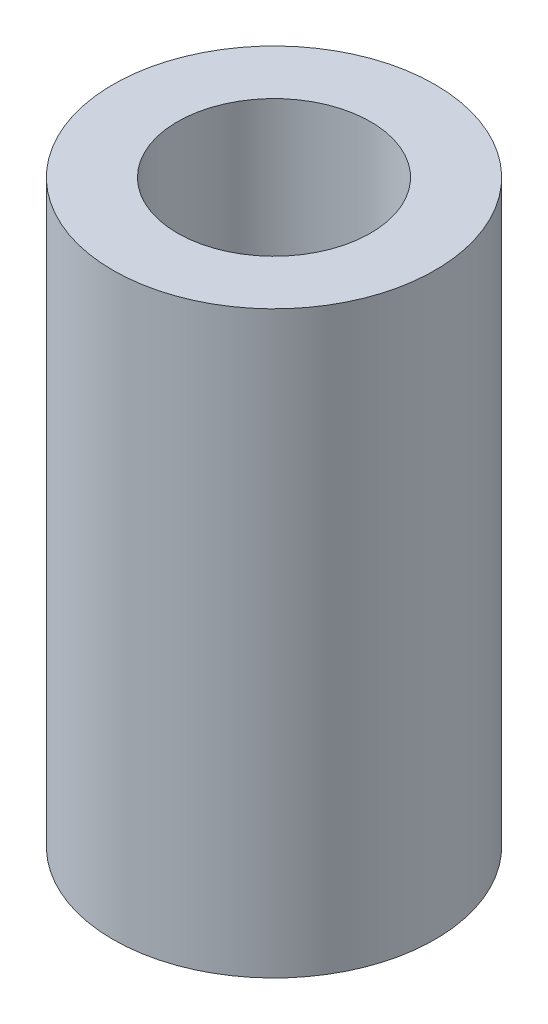
ISO-10303-21;
HEADER;
FILE_DESCRIPTION(('STEP AP214'),'2;1');
FILE_NAME('part.step','',(''),(''),'','','');
FILE_SCHEMA(('AUTOMOTIVE_DESIGN { 1 0 10303 214 1 1 1 1 }'));
ENDSEC;
DATA;
#1=APPLICATION_CONTEXT('core data for automotive mechanical design processes');
#2=APPLICATION_PROTOCOL_DEFINITION('international standard','automotive_design',2000,#1);
#3=PRODUCT_CONTEXT('',#1,'mechanical');
#4=PRODUCT('Part','Part','',(#3));
#5=PRODUCT_RELATED_PRODUCT_CATEGORY('part','',(#4));
#6=PRODUCT_DEFINITION_FORMATION('','',#4);
#7=PRODUCT_DEFINITION_CONTEXT('part definition',#1,'design');
#8=PRODUCT_DEFINITION('design','',#6,#7);
#9=PRODUCT_DEFINITION_SHAPE('','',#8);
#10=(LENGTH_UNIT() NAMED_UNIT(*) SI_UNIT(.MILLI.,.METRE.));
#11=(NAMED_UNIT(*) PLANE_ANGLE_UNIT() SI_UNIT($,.RADIAN.));
#12=(NAMED_UNIT(*) SI_UNIT($,.STERADIAN.) SOLID_ANGLE_UNIT());
#13=UNCERTAINTY_MEASURE_WITH_UNIT(LENGTH_MEASURE(1.E-05),#10,'distance_accuracy_value','');
#14=(GEOMETRIC_REPRESENTATION_CONTEXT(3) GLOBAL_UNCERTAINTY_ASSIGNED_CONTEXT((#13)) GLOBAL_UNIT_ASSIGNED_CONTEXT((#10,
#11,#12)) REPRESENTATION_CONTEXT('',''));
#15=CARTESIAN_POINT('',(0.,0.,0.));
#16=DIRECTION('',(0.,0.,1.));
#17=DIRECTION('',(1.,0.,0.));
#18=AXIS2_PLACEMENT_3D('',#15,#16,#17);
#19=CARTESIAN_POINT('',(0.,3.,0.));
#20=DIRECTION('',(0.,-1.,0.));
#21=DIRECTION('',(0.,0.,-1.));
#22=AXIS2_PLACEMENT_3D('',#19,#20,#21);
#23=CYLINDRICAL_SURFACE('',#22,5.);
#24=CARTESIAN_POINT('',(0.,0.,0.));
#25=DIRECTION('',(0.,1.,0.));
#26=DIRECTION('',(0.,0.,1.));
#27=AXIS2_PLACEMENT_3D('',#24,#25,#26);
#28=CIRCLE('',#27,5.);
#29=CARTESIAN_POINT('',(0.,0.,5.));
#30=VERTEX_POINT('',#29);
#31=EDGE_CURVE('E41',#30,#30,#28,.T.);
#32=ORIENTED_EDGE('',*,*,#31,.T.);
#33=EDGE_LOOP('',(#32));
#34=FACE_BOUND('',#33,.T.);
#35=CARTESIAN_POINT('',(0.,18.,0.));
#36=DIRECTION('',(0.,1.,0.));
#37=DIRECTION('',(0.,0.,1.));
#38=AXIS2_PLACEMENT_3D('',#35,#36,#37);
#39=CIRCLE('',#38,5.);
#40=CARTESIAN_POINT('',(0.,18.,5.));
#41=VERTEX_POINT('',#40);
#42=EDGE_CURVE('E45',#41,#41,#39,.T.);
#43=ORIENTED_EDGE('',*,*,#42,.F.);
#44=EDGE_LOOP('',(#43));
#45=FACE_BOUND('',#44,.T.);
#46=ADVANCED_FACE('F34',(#34,#45),#23,.T.);
#47=CARTESIAN_POINT('',(0.,0.,0.));
#48=DIRECTION('',(0.,1.,0.));
#49=DIRECTION('',(0.,0.,1.));
#50=AXIS2_PLACEMENT_3D('',#47,#48,#49);
#51=PLANE('',#50);
#52=CARTESIAN_POINT('',(0.,0.,0.));
#53=DIRECTION('',(0.,-1.,0.));
#54=DIRECTION('',(0.,0.,-1.));
#55=AXIS2_PLACEMENT_3D('',#52,#53,#54);
#56=CIRCLE('',#55,1.45);
#57=CARTESIAN_POINT('',(0.,0.,-1.45));
#58=VERTEX_POINT('',#57);
#59=EDGE_CURVE('E53',#58,#58,#56,.T.);
#60=ORIENTED_EDGE('',*,*,#59,.F.);
#61=EDGE_LOOP('',(#60));
#62=FACE_BOUND('',#61,.T.);
#63=ORIENTED_EDGE('',*,*,#31,.F.);
#64=EDGE_LOOP('',(#63));
#65=FACE_BOUND('',#64,.T.);
#66=ADVANCED_FACE('F77',(#62,#65),#51,.F.);
#67=CARTESIAN_POINT('',(0.,18.,0.));
#68=DIRECTION('',(0.,1.,0.));
#69=DIRECTION('',(0.,0.,1.));
#70=AXIS2_PLACEMENT_3D('',#67,#68,#69);
#71=PLANE('',#70);
#72=ORIENTED_EDGE('',*,*,#42,.T.);
#73=EDGE_LOOP('',(#72));
#74=FACE_BOUND('',#73,.T.);
#75=CARTESIAN_POINT('',(0.,18.,0.));
#76=DIRECTION('',(0.,1.,0.));
#77=DIRECTION('',(0.,0.,1.));
#78=AXIS2_PLACEMENT_3D('',#75,#76,#77);
#79=CIRCLE('',#78,3.);
#80=CARTESIAN_POINT('',(0.,18.,3.));
#81=VERTEX_POINT('',#80);
#82=EDGE_CURVE('E50',#81,#81,#79,.T.);
#83=ORIENTED_EDGE('',*,*,#82,.F.);
#84=EDGE_LOOP('',(#83));
#85=FACE_BOUND('',#84,.T.);
#86=ADVANCED_FACE('F72',(#74,#85),#71,.T.);
#87=CARTESIAN_POINT('',(0.,18.,0.));
#88=DIRECTION('',(0.,-1.,0.));
#89=DIRECTION('',(0.,0.,-1.));
#90=AXIS2_PLACEMENT_3D('',#87,#88,#89);
#91=CYLINDRICAL_SURFACE('',#90,3.);
#92=ORIENTED_EDGE('',*,*,#82,.T.);
#93=EDGE_LOOP('',(#92));
#94=FACE_BOUND('',#93,.T.);
#95=CARTESIAN_POINT('',(0.,3.,0.));
#96=DIRECTION('',(0.,1.,0.));
#97=DIRECTION('',(0.,0.,1.));
#98=AXIS2_PLACEMENT_3D('',#95,#96,#97);
#99=CIRCLE('',#98,3.);
#100=CARTESIAN_POINT('',(0.,3.,3.));
#101=VERTEX_POINT('',#100);
#102=EDGE_CURVE('E10',#101,#101,#99,.F.);
#103=ORIENTED_EDGE('',*,*,#102,.T.);
#104=EDGE_LOOP('',(#103));
#105=FACE_BOUND('',#104,.T.);
#106=ADVANCED_FACE('F65',(#94,#105),#91,.F.);
#107=CARTESIAN_POINT('',(0.,3.,0.));
#108=DIRECTION('',(0.,1.,0.));
#109=DIRECTION('',(0.,0.,1.));
#110=AXIS2_PLACEMENT_3D('',#107,#108,#109);
#111=PLANE('',#110);
#112=CARTESIAN_POINT('',(0.,3.,0.));
#113=DIRECTION('',(0.,1.,0.));
#114=DIRECTION('',(0.,0.,1.));
#115=AXIS2_PLACEMENT_3D('',#112,#113,#114);
#116=CIRCLE('',#115,1.45);
#117=CARTESIAN_POINT('',(0.,3.,1.45));
#118=VERTEX_POINT('',#117);
#119=EDGE_CURVE('E37',#118,#118,#116,.T.);
#120=ORIENTED_EDGE('',*,*,#119,.F.);
#121=EDGE_LOOP('',(#120));
#122=FACE_BOUND('',#121,.T.);
#123=ORIENTED_EDGE('',*,*,#102,.F.);
#124=EDGE_LOOP('',(#123));
#125=FACE_BOUND('',#124,.T.);
#126=ADVANCED_FACE('F62',(#122,#125),#111,.T.);
#127=CARTESIAN_POINT('',(0.,0.,0.));
#128=DIRECTION('',(0.,-1.,0.));
#129=DIRECTION('',(0.,0.,-1.));
#130=AXIS2_PLACEMENT_3D('',#127,#128,#129);
#131=CYLINDRICAL_SURFACE('',#130,1.45);
#132=ORIENTED_EDGE('',*,*,#119,.T.);
#133=EDGE_LOOP('',(#132));
#134=FACE_BOUND('',#133,.T.);
#135=ORIENTED_EDGE('',*,*,#59,.T.);
#136=EDGE_LOOP('',(#135));
#137=FACE_BOUND('',#136,.T.);
#138=ADVANCED_FACE('F60',(#134,#137),#131,.F.);
#139=CLOSED_SHELL('',(#46,#66,#86,#106,#126,#138));
#140=MANIFOLD_SOLID_BREP('B2',#139);
#141=ADVANCED_BREP_SHAPE_REPRESENTATION('',(#18,#140),#14);
#142=SHAPE_DEFINITION_REPRESENTATION(#9,#141);
ENDSEC;
END-ISO-10303-21;
